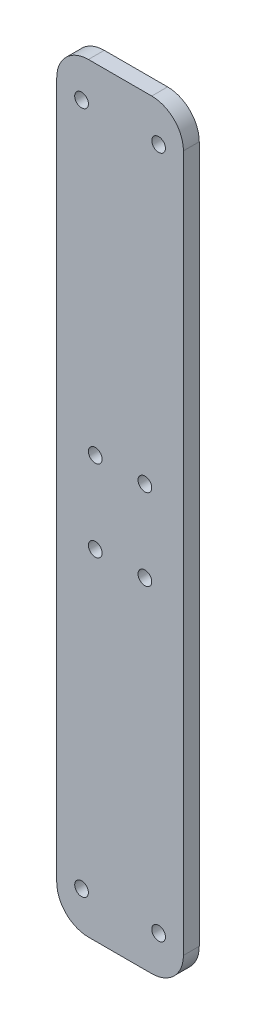
ISO-10303-21;
HEADER;
FILE_DESCRIPTION(('STEP AP214'),'2;1');
FILE_NAME('part.step','',(''),(''),'','','');
FILE_SCHEMA(('AUTOMOTIVE_DESIGN { 1 0 10303 214 1 1 1 1 }'));
ENDSEC;
DATA;
#1=APPLICATION_CONTEXT('core data for automotive mechanical design processes');
#2=APPLICATION_PROTOCOL_DEFINITION('international standard','automotive_design',2000,#1);
#3=PRODUCT_CONTEXT('',#1,'mechanical');
#4=PRODUCT('Part','Part','',(#3));
#5=PRODUCT_RELATED_PRODUCT_CATEGORY('part','',(#4));
#6=PRODUCT_DEFINITION_FORMATION('','',#4);
#7=PRODUCT_DEFINITION_CONTEXT('part definition',#1,'design');
#8=PRODUCT_DEFINITION('design','',#6,#7);
#9=PRODUCT_DEFINITION_SHAPE('','',#8);
#10=(LENGTH_UNIT() NAMED_UNIT(*) SI_UNIT(.MILLI.,.METRE.));
#11=(NAMED_UNIT(*) PLANE_ANGLE_UNIT() SI_UNIT($,.RADIAN.));
#12=(NAMED_UNIT(*) SI_UNIT($,.STERADIAN.) SOLID_ANGLE_UNIT());
#13=UNCERTAINTY_MEASURE_WITH_UNIT(LENGTH_MEASURE(1.E-05),#10,'distance_accuracy_value','');
#14=(GEOMETRIC_REPRESENTATION_CONTEXT(3) GLOBAL_UNCERTAINTY_ASSIGNED_CONTEXT((#13)) GLOBAL_UNIT_ASSIGNED_CONTEXT((#10,
#11,#12)) REPRESENTATION_CONTEXT('',''));
#15=CARTESIAN_POINT('',(0.,0.,0.));
#16=DIRECTION('',(0.,0.,1.));
#17=DIRECTION('',(1.,0.,0.));
#18=AXIS2_PLACEMENT_3D('',#15,#16,#17);
#19=CARTESIAN_POINT('',(-72.6000000000004,-136.95,1.65));
#20=DIRECTION('',(0.,0.,1.));
#21=DIRECTION('',(1.,0.,0.));
#22=AXIS2_PLACEMENT_3D('',#19,#20,#21);
#23=CYLINDRICAL_SURFACE('',#22,2.74999999999998);
#24=CARTESIAN_POINT('',(-72.6000000000004,-136.95,8.));
#25=DIRECTION('',(0.,0.,-1.));
#26=DIRECTION('',(-1.,0.,0.));
#27=AXIS2_PLACEMENT_3D('',#24,#25,#26);
#28=CIRCLE('',#27,2.74999999999998);
#29=CARTESIAN_POINT('',(-75.3500000000004,-136.95,8.));
#30=VERTEX_POINT('',#29);
#31=EDGE_CURVE('E201',#30,#30,#28,.F.);
#32=ORIENTED_EDGE('',*,*,#31,.T.);
#33=EDGE_LOOP('',(#32));
#34=FACE_BOUND('',#33,.T.);
#35=CARTESIAN_POINT('',(-72.6000000000004,-136.95,1.65));
#36=DIRECTION('',(0.,0.,-1.));
#37=DIRECTION('',(-1.,0.,0.));
#38=AXIS2_PLACEMENT_3D('',#35,#36,#37);
#39=CIRCLE('',#38,2.74999999999998);
#40=CARTESIAN_POINT('',(-75.3500000000004,-136.95,1.65));
#41=VERTEX_POINT('',#40);
#42=EDGE_CURVE('E156',#41,#41,#39,.F.);
#43=ORIENTED_EDGE('',*,*,#42,.F.);
#44=EDGE_LOOP('',(#43));
#45=FACE_BOUND('',#44,.T.);
#46=ADVANCED_FACE('F46',(#34,#45),#23,.F.);
#47=CARTESIAN_POINT('',(-72.6000000000004,136.95,1.65));
#48=DIRECTION('',(0.,0.,1.));
#49=DIRECTION('',(1.,0.,0.));
#50=AXIS2_PLACEMENT_3D('',#47,#48,#49);
#51=CYLINDRICAL_SURFACE('',#50,2.75000000000001);
#52=CARTESIAN_POINT('',(-72.6000000000004,136.95,8.));
#53=DIRECTION('',(0.,0.,-1.));
#54=DIRECTION('',(-1.,0.,0.));
#55=AXIS2_PLACEMENT_3D('',#52,#53,#54);
#56=CIRCLE('',#55,2.75000000000001);
#57=CARTESIAN_POINT('',(-75.3500000000004,136.95,8.));
#58=VERTEX_POINT('',#57);
#59=EDGE_CURVE('E197',#58,#58,#56,.F.);
#60=ORIENTED_EDGE('',*,*,#59,.T.);
#61=EDGE_LOOP('',(#60));
#62=FACE_BOUND('',#61,.T.);
#63=CARTESIAN_POINT('',(-72.6000000000004,136.95,1.65));
#64=DIRECTION('',(0.,0.,-1.));
#65=DIRECTION('',(-1.,0.,0.));
#66=AXIS2_PLACEMENT_3D('',#63,#64,#65);
#67=CIRCLE('',#66,2.75000000000001);
#68=CARTESIAN_POINT('',(-75.3500000000004,136.95,1.65));
#69=VERTEX_POINT('',#68);
#70=EDGE_CURVE('E152',#69,#69,#67,.F.);
#71=ORIENTED_EDGE('',*,*,#70,.F.);
#72=EDGE_LOOP('',(#71));
#73=FACE_BOUND('',#72,.T.);
#74=ADVANCED_FACE('F303',(#62,#73),#51,.F.);
#75=CARTESIAN_POINT('',(-41.6999999999999,136.95,1.65));
#76=DIRECTION('',(0.,0.,1.));
#77=DIRECTION('',(1.,0.,0.));
#78=AXIS2_PLACEMENT_3D('',#75,#76,#77);
#79=CYLINDRICAL_SURFACE('',#78,2.74999999999998);
#80=CARTESIAN_POINT('',(-41.6999999999999,136.95,8.));
#81=DIRECTION('',(0.,0.,-1.));
#82=DIRECTION('',(-1.,0.,0.));
#83=AXIS2_PLACEMENT_3D('',#80,#81,#82);
#84=CIRCLE('',#83,2.74999999999998);
#85=CARTESIAN_POINT('',(-44.4499999999999,136.95,8.));
#86=VERTEX_POINT('',#85);
#87=EDGE_CURVE('E193',#86,#86,#84,.F.);
#88=ORIENTED_EDGE('',*,*,#87,.T.);
#89=EDGE_LOOP('',(#88));
#90=FACE_BOUND('',#89,.T.);
#91=CARTESIAN_POINT('',(-41.6999999999999,136.95,1.65));
#92=DIRECTION('',(0.,0.,-1.));
#93=DIRECTION('',(-1.,0.,0.));
#94=AXIS2_PLACEMENT_3D('',#91,#92,#93);
#95=CIRCLE('',#94,2.74999999999998);
#96=CARTESIAN_POINT('',(-44.4499999999999,136.95,1.65));
#97=VERTEX_POINT('',#96);
#98=EDGE_CURVE('E148',#97,#97,#95,.F.);
#99=ORIENTED_EDGE('',*,*,#98,.F.);
#100=EDGE_LOOP('',(#99));
#101=FACE_BOUND('',#100,.T.);
#102=ADVANCED_FACE('F310',(#90,#101),#79,.F.);
#103=CARTESIAN_POINT('',(-41.6999999999999,-136.95,1.65));
#104=DIRECTION('',(0.,0.,1.));
#105=DIRECTION('',(1.,0.,0.));
#106=AXIS2_PLACEMENT_3D('',#103,#104,#105);
#107=CYLINDRICAL_SURFACE('',#106,2.74999999999998);
#108=CARTESIAN_POINT('',(-41.6999999999999,-136.95,8.));
#109=DIRECTION('',(0.,0.,-1.));
#110=DIRECTION('',(-1.,0.,0.));
#111=AXIS2_PLACEMENT_3D('',#108,#109,#110);
#112=CIRCLE('',#111,2.74999999999998);
#113=CARTESIAN_POINT('',(-44.4499999999998,-136.95,8.));
#114=VERTEX_POINT('',#113);
#115=EDGE_CURVE('E189',#114,#114,#112,.F.);
#116=ORIENTED_EDGE('',*,*,#115,.T.);
#117=EDGE_LOOP('',(#116));
#118=FACE_BOUND('',#117,.T.);
#119=CARTESIAN_POINT('',(-41.6999999999999,-136.95,1.65));
#120=DIRECTION('',(0.,0.,-1.));
#121=DIRECTION('',(-1.,0.,0.));
#122=AXIS2_PLACEMENT_3D('',#119,#120,#121);
#123=CIRCLE('',#122,2.74999999999998);
#124=CARTESIAN_POINT('',(-44.4499999999998,-136.95,1.65));
#125=VERTEX_POINT('',#124);
#126=EDGE_CURVE('E141',#125,#125,#123,.F.);
#127=ORIENTED_EDGE('',*,*,#126,.F.);
#128=EDGE_LOOP('',(#127));
#129=FACE_BOUND('',#128,.T.);
#130=ADVANCED_FACE('F319',(#118,#129),#107,.F.);
#131=CARTESIAN_POINT('',(-44.4499999999998,139.7,1.65));
#132=DIRECTION('',(0.,0.,1.));
#133=DIRECTION('',(1.,0.,0.));
#134=AXIS2_PLACEMENT_3D('',#131,#132,#133);
#135=CYLINDRICAL_SURFACE('',#134,12.6999999999998);
#136=CARTESIAN_POINT('',(-44.4499999999998,139.7,8.));
#137=DIRECTION('',(0.,0.,-1.));
#138=DIRECTION('',(-1.,0.,0.));
#139=AXIS2_PLACEMENT_3D('',#136,#137,#138);
#140=CIRCLE('',#139,12.6999999999998);
#141=CARTESIAN_POINT('',(-31.7500000000003,139.700000000002,8.));
#142=VERTEX_POINT('',#141);
#143=CARTESIAN_POINT('',(-44.4499999999998,152.400000000001,8.));
#144=VERTEX_POINT('',#143);
#145=EDGE_CURVE('E160',#142,#144,#140,.F.);
#146=ORIENTED_EDGE('',*,*,#145,.F.);
#147=DIRECTION('',(0.,0.,1.));
#148=VECTOR('',#147,1.);
#149=CARTESIAN_POINT('',(-31.7500000000003,139.700000000002,1.65));
#150=LINE('',#149,#148);
#151=CARTESIAN_POINT('',(-31.7500000000003,139.700000000002,1.65));
#152=VERTEX_POINT('',#151);
#153=EDGE_CURVE('E11',#152,#142,#150,.T.);
#154=ORIENTED_EDGE('',*,*,#153,.F.);
#155=CARTESIAN_POINT('',(-44.4499999999998,139.7,1.65));
#156=DIRECTION('',(0.,0.,-1.));
#157=DIRECTION('',(-1.,0.,0.));
#158=AXIS2_PLACEMENT_3D('',#155,#156,#157);
#159=CIRCLE('',#158,12.6999999999998);
#160=CARTESIAN_POINT('',(-44.4499999999998,152.400000000001,1.65));
#161=VERTEX_POINT('',#160);
#162=EDGE_CURVE('E205',#152,#161,#159,.F.);
#163=ORIENTED_EDGE('',*,*,#162,.T.);
#164=DIRECTION('',(0.,0.,1.));
#165=VECTOR('',#164,1.);
#166=CARTESIAN_POINT('',(-44.4499999999998,152.400000000001,1.65));
#167=LINE('',#166,#165);
#168=EDGE_CURVE('E98',#161,#144,#167,.T.);
#169=ORIENTED_EDGE('',*,*,#168,.T.);
#170=EDGE_LOOP('',(#146,#154,#163,#169));
#171=FACE_BOUND('',#170,.T.);
#172=ADVANCED_FACE('F48',(#171),#135,.T.);
#173=CARTESIAN_POINT('',(-31.75,0.,1.65));
#174=DIRECTION('',(1.,0.,0.));
#175=DIRECTION('',(0.,0.,-1.));
#176=AXIS2_PLACEMENT_3D('',#173,#174,#175);
#177=PLANE('',#176);
#178=DIRECTION('',(0.,1.,0.));
#179=VECTOR('',#178,1.);
#180=CARTESIAN_POINT('',(-31.75,0.,8.));
#181=LINE('',#180,#179);
#182=CARTESIAN_POINT('',(-31.7500000000003,-139.7,8.));
#183=VERTEX_POINT('',#182);
#184=EDGE_CURVE('E164',#183,#142,#181,.T.);
#185=ORIENTED_EDGE('',*,*,#184,.F.);
#186=DIRECTION('',(0.,0.,1.));
#187=VECTOR('',#186,1.);
#188=CARTESIAN_POINT('',(-31.7500000000003,-139.7,1.65));
#189=LINE('',#188,#187);
#190=CARTESIAN_POINT('',(-31.7500000000003,-139.7,1.65));
#191=VERTEX_POINT('',#190);
#192=EDGE_CURVE('E56',#191,#183,#189,.T.);
#193=ORIENTED_EDGE('',*,*,#192,.F.);
#194=DIRECTION('',(0.,1.,0.));
#195=VECTOR('',#194,1.);
#196=CARTESIAN_POINT('',(-31.75,0.,1.65));
#197=LINE('',#196,#195);
#198=EDGE_CURVE('E241',#191,#152,#197,.T.);
#199=ORIENTED_EDGE('',*,*,#198,.T.);
#200=ORIENTED_EDGE('',*,*,#153,.T.);
#201=EDGE_LOOP('',(#185,#193,#199,#200));
#202=FACE_BOUND('',#201,.T.);
#203=ADVANCED_FACE('F228',(#202),#177,.T.);
#204=CARTESIAN_POINT('',(-44.4500000000002,-139.7,1.65));
#205=DIRECTION('',(0.,0.,1.));
#206=DIRECTION('',(1.,0.,0.));
#207=AXIS2_PLACEMENT_3D('',#204,#205,#206);
#208=CYLINDRICAL_SURFACE('',#207,12.7000000000001);
#209=CARTESIAN_POINT('',(-44.4500000000002,-139.7,8.));
#210=DIRECTION('',(0.,0.,-1.));
#211=DIRECTION('',(-1.,0.,0.));
#212=AXIS2_PLACEMENT_3D('',#209,#210,#211);
#213=CIRCLE('',#212,12.7000000000001);
#214=CARTESIAN_POINT('',(-44.4500000000002,-152.4,8.));
#215=VERTEX_POINT('',#214);
#216=EDGE_CURVE('E169',#215,#183,#213,.F.);
#217=ORIENTED_EDGE('',*,*,#216,.F.);
#218=DIRECTION('',(0.,0.,1.));
#219=VECTOR('',#218,1.);
#220=CARTESIAN_POINT('',(-44.4500000000002,-152.4,1.65));
#221=LINE('',#220,#219);
#222=CARTESIAN_POINT('',(-44.4500000000002,-152.4,1.65));
#223=VERTEX_POINT('',#222);
#224=EDGE_CURVE('E215',#223,#215,#221,.T.);
#225=ORIENTED_EDGE('',*,*,#224,.F.);
#226=CARTESIAN_POINT('',(-44.4500000000002,-139.7,1.65));
#227=DIRECTION('',(0.,0.,-1.));
#228=DIRECTION('',(-1.,0.,0.));
#229=AXIS2_PLACEMENT_3D('',#226,#227,#228);
#230=CIRCLE('',#229,12.7000000000001);
#231=EDGE_CURVE('E224',#223,#191,#230,.F.);
#232=ORIENTED_EDGE('',*,*,#231,.T.);
#233=ORIENTED_EDGE('',*,*,#192,.T.);
#234=EDGE_LOOP('',(#217,#225,#232,#233));
#235=FACE_BOUND('',#234,.T.);
#236=ADVANCED_FACE('F222',(#235),#208,.T.);
#237=CARTESIAN_POINT('',(0.,-152.4,1.65));
#238=DIRECTION('',(0.,1.,0.));
#239=DIRECTION('',(0.,0.,1.));
#240=AXIS2_PLACEMENT_3D('',#237,#238,#239);
#241=PLANE('',#240);
#242=DIRECTION('',(-1.,0.,0.));
#243=VECTOR('',#242,1.);
#244=CARTESIAN_POINT('',(0.,-152.4,8.));
#245=LINE('',#244,#243);
#246=CARTESIAN_POINT('',(-69.8500000000004,-152.4,8.));
#247=VERTEX_POINT('',#246);
#248=EDGE_CURVE('E173',#215,#247,#245,.T.);
#249=ORIENTED_EDGE('',*,*,#248,.T.);
#250=DIRECTION('',(0.,0.,1.));
#251=VECTOR('',#250,1.);
#252=CARTESIAN_POINT('',(-69.8500000000004,-152.4,1.65));
#253=LINE('',#252,#251);
#254=CARTESIAN_POINT('',(-69.8500000000004,-152.4,1.65));
#255=VERTEX_POINT('',#254);
#256=EDGE_CURVE('E212',#255,#247,#253,.T.);
#257=ORIENTED_EDGE('',*,*,#256,.F.);
#258=DIRECTION('',(-1.,0.,0.));
#259=VECTOR('',#258,1.);
#260=CARTESIAN_POINT('',(0.,-152.4,1.65));
#261=LINE('',#260,#259);
#262=EDGE_CURVE('E238',#223,#255,#261,.T.);
#263=ORIENTED_EDGE('',*,*,#262,.F.);
#264=ORIENTED_EDGE('',*,*,#224,.T.);
#265=EDGE_LOOP('',(#249,#257,#263,#264));
#266=FACE_BOUND('',#265,.T.);
#267=ADVANCED_FACE('F236',(#266),#241,.F.);
#268=CARTESIAN_POINT('',(-69.8500000000004,-139.7,1.65));
#269=DIRECTION('',(0.,0.,1.));
#270=DIRECTION('',(1.,0.,0.));
#271=AXIS2_PLACEMENT_3D('',#268,#269,#270);
#272=CYLINDRICAL_SURFACE('',#271,12.7000000000001);
#273=CARTESIAN_POINT('',(-69.8500000000004,-139.7,8.));
#274=DIRECTION('',(0.,0.,-1.));
#275=DIRECTION('',(-1.,0.,0.));
#276=AXIS2_PLACEMENT_3D('',#273,#274,#275);
#277=CIRCLE('',#276,12.7000000000001);
#278=CARTESIAN_POINT('',(-82.5500000000005,-139.7,8.));
#279=VERTEX_POINT('',#278);
#280=EDGE_CURVE('E177',#279,#247,#277,.F.);
#281=ORIENTED_EDGE('',*,*,#280,.F.);
#282=DIRECTION('',(0.,0.,1.));
#283=VECTOR('',#282,1.);
#284=CARTESIAN_POINT('',(-82.5500000000005,-139.7,1.65));
#285=LINE('',#284,#283);
#286=CARTESIAN_POINT('',(-82.5500000000005,-139.7,1.65));
#287=VERTEX_POINT('',#286);
#288=EDGE_CURVE('E135',#287,#279,#285,.T.);
#289=ORIENTED_EDGE('',*,*,#288,.F.);
#290=CARTESIAN_POINT('',(-69.8500000000004,-139.7,1.65));
#291=DIRECTION('',(0.,0.,-1.));
#292=DIRECTION('',(-1.,0.,0.));
#293=AXIS2_PLACEMENT_3D('',#290,#291,#292);
#294=CIRCLE('',#293,12.7000000000001);
#295=EDGE_CURVE('E122',#287,#255,#294,.F.);
#296=ORIENTED_EDGE('',*,*,#295,.T.);
#297=ORIENTED_EDGE('',*,*,#256,.T.);
#298=EDGE_LOOP('',(#281,#289,#296,#297));
#299=FACE_BOUND('',#298,.T.);
#300=ADVANCED_FACE('F249',(#299),#272,.T.);
#301=CARTESIAN_POINT('',(-82.5500000000005,0.,1.65));
#302=DIRECTION('',(1.,0.,0.));
#303=DIRECTION('',(0.,0.,-1.));
#304=AXIS2_PLACEMENT_3D('',#301,#302,#303);
#305=PLANE('',#304);
#306=DIRECTION('',(0.,1.,0.));
#307=VECTOR('',#306,1.);
#308=CARTESIAN_POINT('',(-82.5500000000005,0.,8.));
#309=LINE('',#308,#307);
#310=CARTESIAN_POINT('',(-82.5500000000005,139.700000000002,8.));
#311=VERTEX_POINT('',#310);
#312=EDGE_CURVE('E130',#279,#311,#309,.T.);
#313=ORIENTED_EDGE('',*,*,#312,.T.);
#314=DIRECTION('',(0.,0.,1.));
#315=VECTOR('',#314,1.);
#316=CARTESIAN_POINT('',(-82.5500000000005,139.700000000002,1.65));
#317=LINE('',#316,#315);
#318=CARTESIAN_POINT('',(-82.5500000000005,139.700000000002,1.65));
#319=VERTEX_POINT('',#318);
#320=EDGE_CURVE('E127',#319,#311,#317,.T.);
#321=ORIENTED_EDGE('',*,*,#320,.F.);
#322=DIRECTION('',(0.,1.,0.));
#323=VECTOR('',#322,1.);
#324=CARTESIAN_POINT('',(-82.5500000000005,0.,1.65));
#325=LINE('',#324,#323);
#326=EDGE_CURVE('E116',#287,#319,#325,.T.);
#327=ORIENTED_EDGE('',*,*,#326,.F.);
#328=ORIENTED_EDGE('',*,*,#288,.T.);
#329=EDGE_LOOP('',(#313,#321,#327,#328));
#330=FACE_BOUND('',#329,.T.);
#331=ADVANCED_FACE('F128',(#330),#305,.F.);
#332=CARTESIAN_POINT('',(-69.8500000000001,139.7,1.65));
#333=DIRECTION('',(0.,0.,1.));
#334=DIRECTION('',(1.,0.,0.));
#335=AXIS2_PLACEMENT_3D('',#332,#333,#334);
#336=CYLINDRICAL_SURFACE('',#335,12.7000000000004);
#337=CARTESIAN_POINT('',(-69.8500000000001,139.7,8.));
#338=DIRECTION('',(0.,0.,-1.));
#339=DIRECTION('',(-1.,0.,0.));
#340=AXIS2_PLACEMENT_3D('',#337,#338,#339);
#341=CIRCLE('',#340,12.7000000000004);
#342=CARTESIAN_POINT('',(-69.8500000000001,152.400000000001,8.));
#343=VERTEX_POINT('',#342);
#344=EDGE_CURVE('E183',#343,#311,#341,.F.);
#345=ORIENTED_EDGE('',*,*,#344,.F.);
#346=DIRECTION('',(0.,0.,1.));
#347=VECTOR('',#346,1.);
#348=CARTESIAN_POINT('',(-69.8500000000001,152.400000000001,1.65));
#349=LINE('',#348,#347);
#350=CARTESIAN_POINT('',(-69.8500000000001,152.400000000001,1.65));
#351=VERTEX_POINT('',#350);
#352=EDGE_CURVE('E91',#351,#343,#349,.T.);
#353=ORIENTED_EDGE('',*,*,#352,.F.);
#354=CARTESIAN_POINT('',(-69.8500000000001,139.7,1.65));
#355=DIRECTION('',(0.,0.,-1.));
#356=DIRECTION('',(-1.,0.,0.));
#357=AXIS2_PLACEMENT_3D('',#354,#355,#356);
#358=CIRCLE('',#357,12.7000000000004);
#359=EDGE_CURVE('E120',#351,#319,#358,.F.);
#360=ORIENTED_EDGE('',*,*,#359,.T.);
#361=ORIENTED_EDGE('',*,*,#320,.T.);
#362=EDGE_LOOP('',(#345,#353,#360,#361));
#363=FACE_BOUND('',#362,.T.);
#364=ADVANCED_FACE('F137',(#363),#336,.T.);
#365=CARTESIAN_POINT('',(0.,152.400000000002,1.65));
#366=DIRECTION('',(0.,-1.,0.));
#367=DIRECTION('',(0.,0.,-1.));
#368=AXIS2_PLACEMENT_3D('',#365,#366,#367);
#369=PLANE('',#368);
#370=DIRECTION('',(1.,0.,0.));
#371=VECTOR('',#370,1.);
#372=CARTESIAN_POINT('',(0.,152.400000000002,8.));
#373=LINE('',#372,#371);
#374=EDGE_CURVE('E186',#343,#144,#373,.T.);
#375=ORIENTED_EDGE('',*,*,#374,.T.);
#376=ORIENTED_EDGE('',*,*,#168,.F.);
#377=DIRECTION('',(1.,0.,0.));
#378=VECTOR('',#377,1.);
#379=CARTESIAN_POINT('',(0.,152.400000000002,1.65));
#380=LINE('',#379,#378);
#381=EDGE_CURVE('E64',#351,#161,#380,.T.);
#382=ORIENTED_EDGE('',*,*,#381,.F.);
#383=ORIENTED_EDGE('',*,*,#352,.T.);
#384=EDGE_LOOP('',(#375,#376,#382,#383));
#385=FACE_BOUND('',#384,.T.);
#386=ADVANCED_FACE('F250',(#385),#369,.F.);
#387=CARTESIAN_POINT('',(0.,0.,1.65));
#388=DIRECTION('',(0.,0.,-1.));
#389=DIRECTION('',(-1.,0.,0.));
#390=AXIS2_PLACEMENT_3D('',#387,#388,#389);
#391=PLANE('',#390);
#392=CARTESIAN_POINT('',(-47.2000000000004,16.3,1.65));
#393=DIRECTION('',(0.,0.,-1.));
#394=DIRECTION('',(-1.,0.,0.));
#395=AXIS2_PLACEMENT_3D('',#392,#393,#394);
#396=CIRCLE('',#395,2.74999999999997);
#397=CARTESIAN_POINT('',(-49.9500000000004,16.3,1.65));
#398=VERTEX_POINT('',#397);
#399=EDGE_CURVE('E165',#398,#398,#396,.T.);
#400=ORIENTED_EDGE('',*,*,#399,.F.);
#401=EDGE_LOOP('',(#400));
#402=FACE_BOUND('',#401,.T.);
#403=CARTESIAN_POINT('',(-67.1000000000004,16.3,1.65));
#404=DIRECTION('',(0.,0.,-1.));
#405=DIRECTION('',(-1.,0.,0.));
#406=AXIS2_PLACEMENT_3D('',#403,#404,#405);
#407=CIRCLE('',#406,2.74999999999999);
#408=CARTESIAN_POINT('',(-69.8500000000004,16.3,1.65));
#409=VERTEX_POINT('',#408);
#410=EDGE_CURVE('E256',#409,#409,#407,.T.);
#411=ORIENTED_EDGE('',*,*,#410,.F.);
#412=EDGE_LOOP('',(#411));
#413=FACE_BOUND('',#412,.T.);
#414=CARTESIAN_POINT('',(-67.1000000000004,-16.3,1.65));
#415=DIRECTION('',(0.,0.,-1.));
#416=DIRECTION('',(-1.,0.,0.));
#417=AXIS2_PLACEMENT_3D('',#414,#415,#416);
#418=CIRCLE('',#417,2.74999999999998);
#419=CARTESIAN_POINT('',(-69.8500000000004,-16.3,1.65));
#420=VERTEX_POINT('',#419);
#421=EDGE_CURVE('E260',#420,#420,#418,.T.);
#422=ORIENTED_EDGE('',*,*,#421,.F.);
#423=EDGE_LOOP('',(#422));
#424=FACE_BOUND('',#423,.T.);
#425=CARTESIAN_POINT('',(-47.2000000000004,-16.3,1.65));
#426=DIRECTION('',(0.,0.,-1.));
#427=DIRECTION('',(-1.,0.,0.));
#428=AXIS2_PLACEMENT_3D('',#425,#426,#427);
#429=CIRCLE('',#428,2.74999999999997);
#430=CARTESIAN_POINT('',(-49.9500000000004,-16.3,1.65));
#431=VERTEX_POINT('',#430);
#432=EDGE_CURVE('E264',#431,#431,#429,.T.);
#433=ORIENTED_EDGE('',*,*,#432,.F.);
#434=EDGE_LOOP('',(#433));
#435=FACE_BOUND('',#434,.T.);
#436=ORIENTED_EDGE('',*,*,#70,.T.);
#437=EDGE_LOOP('',(#436));
#438=FACE_BOUND('',#437,.T.);
#439=ORIENTED_EDGE('',*,*,#126,.T.);
#440=EDGE_LOOP('',(#439));
#441=FACE_BOUND('',#440,.T.);
#442=ORIENTED_EDGE('',*,*,#42,.T.);
#443=EDGE_LOOP('',(#442));
#444=FACE_BOUND('',#443,.T.);
#445=ORIENTED_EDGE('',*,*,#98,.T.);
#446=EDGE_LOOP('',(#445));
#447=FACE_BOUND('',#446,.T.);
#448=ORIENTED_EDGE('',*,*,#162,.F.);
#449=ORIENTED_EDGE('',*,*,#198,.F.);
#450=ORIENTED_EDGE('',*,*,#231,.F.);
#451=ORIENTED_EDGE('',*,*,#262,.T.);
#452=ORIENTED_EDGE('',*,*,#295,.F.);
#453=ORIENTED_EDGE('',*,*,#326,.T.);
#454=ORIENTED_EDGE('',*,*,#359,.F.);
#455=ORIENTED_EDGE('',*,*,#381,.T.);
#456=EDGE_LOOP('',(#448,#449,#450,#451,#452,#453,#454,#455));
#457=FACE_BOUND('',#456,.T.);
#458=ADVANCED_FACE('F118',(#402,#413,#424,#435,#438,#441,#444,#447,#457),#391,.T.);
#459=CARTESIAN_POINT('',(0.,0.,8.));
#460=DIRECTION('',(0.,0.,-1.));
#461=DIRECTION('',(-1.,0.,0.));
#462=AXIS2_PLACEMENT_3D('',#459,#460,#461);
#463=PLANE('',#462);
#464=CARTESIAN_POINT('',(-47.2000000000004,16.3,8.));
#465=DIRECTION('',(0.,0.,-1.));
#466=DIRECTION('',(-1.,0.,0.));
#467=AXIS2_PLACEMENT_3D('',#464,#465,#466);
#468=CIRCLE('',#467,2.74999999999997);
#469=CARTESIAN_POINT('',(-49.9500000000004,16.3,8.));
#470=VERTEX_POINT('',#469);
#471=EDGE_CURVE('E273',#470,#470,#468,.T.);
#472=ORIENTED_EDGE('',*,*,#471,.T.);
#473=EDGE_LOOP('',(#472));
#474=FACE_BOUND('',#473,.T.);
#475=CARTESIAN_POINT('',(-67.1000000000004,16.3,8.));
#476=DIRECTION('',(0.,0.,-1.));
#477=DIRECTION('',(-1.,0.,0.));
#478=AXIS2_PLACEMENT_3D('',#475,#476,#477);
#479=CIRCLE('',#478,2.74999999999999);
#480=CARTESIAN_POINT('',(-69.8500000000004,16.3,8.));
#481=VERTEX_POINT('',#480);
#482=EDGE_CURVE('E277',#481,#481,#479,.T.);
#483=ORIENTED_EDGE('',*,*,#482,.T.);
#484=EDGE_LOOP('',(#483));
#485=FACE_BOUND('',#484,.T.);
#486=CARTESIAN_POINT('',(-67.1000000000004,-16.3,8.));
#487=DIRECTION('',(0.,0.,-1.));
#488=DIRECTION('',(-1.,0.,0.));
#489=AXIS2_PLACEMENT_3D('',#486,#487,#488);
#490=CIRCLE('',#489,2.74999999999998);
#491=CARTESIAN_POINT('',(-69.8500000000004,-16.3,8.));
#492=VERTEX_POINT('',#491);
#493=EDGE_CURVE('E272',#492,#492,#490,.T.);
#494=ORIENTED_EDGE('',*,*,#493,.T.);
#495=EDGE_LOOP('',(#494));
#496=FACE_BOUND('',#495,.T.);
#497=CARTESIAN_POINT('',(-47.2000000000004,-16.3,8.));
#498=DIRECTION('',(0.,0.,-1.));
#499=DIRECTION('',(-1.,0.,0.));
#500=AXIS2_PLACEMENT_3D('',#497,#498,#499);
#501=CIRCLE('',#500,2.74999999999997);
#502=CARTESIAN_POINT('',(-49.9500000000004,-16.3,8.));
#503=VERTEX_POINT('',#502);
#504=EDGE_CURVE('E268',#503,#503,#501,.T.);
#505=ORIENTED_EDGE('',*,*,#504,.T.);
#506=EDGE_LOOP('',(#505));
#507=FACE_BOUND('',#506,.T.);
#508=ORIENTED_EDGE('',*,*,#145,.T.);
#509=ORIENTED_EDGE('',*,*,#374,.F.);
#510=ORIENTED_EDGE('',*,*,#344,.T.);
#511=ORIENTED_EDGE('',*,*,#312,.F.);
#512=ORIENTED_EDGE('',*,*,#280,.T.);
#513=ORIENTED_EDGE('',*,*,#248,.F.);
#514=ORIENTED_EDGE('',*,*,#216,.T.);
#515=ORIENTED_EDGE('',*,*,#184,.T.);
#516=EDGE_LOOP('',(#508,#509,#510,#511,#512,#513,#514,#515));
#517=FACE_BOUND('',#516,.T.);
#518=ORIENTED_EDGE('',*,*,#115,.F.);
#519=EDGE_LOOP('',(#518));
#520=FACE_BOUND('',#519,.T.);
#521=ORIENTED_EDGE('',*,*,#87,.F.);
#522=EDGE_LOOP('',(#521));
#523=FACE_BOUND('',#522,.T.);
#524=ORIENTED_EDGE('',*,*,#59,.F.);
#525=EDGE_LOOP('',(#524));
#526=FACE_BOUND('',#525,.T.);
#527=ORIENTED_EDGE('',*,*,#31,.F.);
#528=EDGE_LOOP('',(#527));
#529=FACE_BOUND('',#528,.T.);
#530=ADVANCED_FACE('F231',(#474,#485,#496,#507,#517,#520,#523,#526,#529),#463,.F.);
#531=CARTESIAN_POINT('',(-47.2000000000004,-16.3,8.));
#532=DIRECTION('',(0.,0.,-1.));
#533=DIRECTION('',(-1.,0.,0.));
#534=AXIS2_PLACEMENT_3D('',#531,#532,#533);
#535=CYLINDRICAL_SURFACE('',#534,2.74999999999997);
#536=ORIENTED_EDGE('',*,*,#432,.T.);
#537=EDGE_LOOP('',(#536));
#538=FACE_BOUND('',#537,.T.);
#539=ORIENTED_EDGE('',*,*,#504,.F.);
#540=EDGE_LOOP('',(#539));
#541=FACE_BOUND('',#540,.T.);
#542=ADVANCED_FACE('F290',(#538,#541),#535,.F.);
#543=CARTESIAN_POINT('',(-67.1000000000004,-16.3,8.));
#544=DIRECTION('',(0.,0.,-1.));
#545=DIRECTION('',(-1.,0.,0.));
#546=AXIS2_PLACEMENT_3D('',#543,#544,#545);
#547=CYLINDRICAL_SURFACE('',#546,2.74999999999998);
#548=ORIENTED_EDGE('',*,*,#421,.T.);
#549=EDGE_LOOP('',(#548));
#550=FACE_BOUND('',#549,.T.);
#551=ORIENTED_EDGE('',*,*,#493,.F.);
#552=EDGE_LOOP('',(#551));
#553=FACE_BOUND('',#552,.T.);
#554=ADVANCED_FACE('F287',(#550,#553),#547,.F.);
#555=CARTESIAN_POINT('',(-67.1000000000004,16.3,8.));
#556=DIRECTION('',(0.,0.,-1.));
#557=DIRECTION('',(-1.,0.,0.));
#558=AXIS2_PLACEMENT_3D('',#555,#556,#557);
#559=CYLINDRICAL_SURFACE('',#558,2.74999999999999);
#560=ORIENTED_EDGE('',*,*,#410,.T.);
#561=EDGE_LOOP('',(#560));
#562=FACE_BOUND('',#561,.T.);
#563=ORIENTED_EDGE('',*,*,#482,.F.);
#564=EDGE_LOOP('',(#563));
#565=FACE_BOUND('',#564,.T.);
#566=ADVANCED_FACE('F289',(#562,#565),#559,.F.);
#567=CARTESIAN_POINT('',(-47.2000000000004,16.3,8.));
#568=DIRECTION('',(0.,0.,-1.));
#569=DIRECTION('',(-1.,0.,0.));
#570=AXIS2_PLACEMENT_3D('',#567,#568,#569);
#571=CYLINDRICAL_SURFACE('',#570,2.74999999999997);
#572=ORIENTED_EDGE('',*,*,#399,.T.);
#573=EDGE_LOOP('',(#572));
#574=FACE_BOUND('',#573,.T.);
#575=ORIENTED_EDGE('',*,*,#471,.F.);
#576=EDGE_LOOP('',(#575));
#577=FACE_BOUND('',#576,.T.);
#578=ADVANCED_FACE('F297',(#574,#577),#571,.F.);
#579=CLOSED_SHELL('',(#46,#74,#102,#130,#172,#203,#236,#267,#300,#331,#364,#386,#458,#530,#542,
#554,#566,#578));
#580=MANIFOLD_SOLID_BREP('B2',#579);
#581=ADVANCED_BREP_SHAPE_REPRESENTATION('',(#18,#580),#14);
#582=SHAPE_DEFINITION_REPRESENTATION(#9,#581);
ENDSEC;
END-ISO-10303-21;
